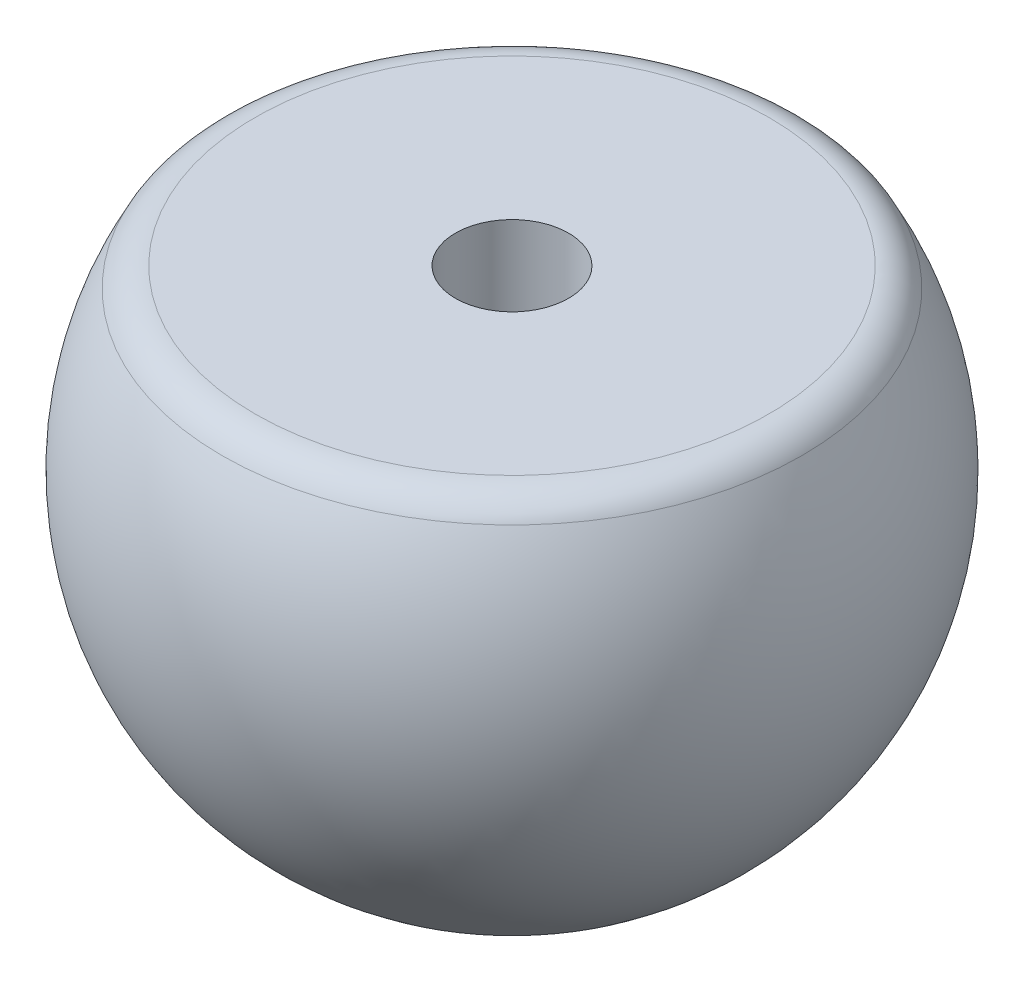
ISO-10303-21;
HEADER;
FILE_DESCRIPTION(('STEP AP214'),'2;1');
FILE_NAME('part.step','',(''),(''),'','','');
FILE_SCHEMA(('AUTOMOTIVE_DESIGN { 1 0 10303 214 1 1 1 1 }'));
ENDSEC;
DATA;
#1=APPLICATION_CONTEXT('core data for automotive mechanical design processes');
#2=APPLICATION_PROTOCOL_DEFINITION('international standard','automotive_design',2000,#1);
#3=PRODUCT_CONTEXT('',#1,'mechanical');
#4=PRODUCT('Part','Part','',(#3));
#5=PRODUCT_RELATED_PRODUCT_CATEGORY('part','',(#4));
#6=PRODUCT_DEFINITION_FORMATION('','',#4);
#7=PRODUCT_DEFINITION_CONTEXT('part definition',#1,'design');
#8=PRODUCT_DEFINITION('design','',#6,#7);
#9=PRODUCT_DEFINITION_SHAPE('','',#8);
#10=(LENGTH_UNIT() NAMED_UNIT(*) SI_UNIT(.MILLI.,.METRE.));
#11=(NAMED_UNIT(*) PLANE_ANGLE_UNIT() SI_UNIT($,.RADIAN.));
#12=(NAMED_UNIT(*) SI_UNIT($,.STERADIAN.) SOLID_ANGLE_UNIT());
#13=UNCERTAINTY_MEASURE_WITH_UNIT(LENGTH_MEASURE(1.E-05),#10,'distance_accuracy_value','');
#14=(GEOMETRIC_REPRESENTATION_CONTEXT(3) GLOBAL_UNCERTAINTY_ASSIGNED_CONTEXT((#13)) GLOBAL_UNIT_ASSIGNED_CONTEXT((#10,
#11,#12)) REPRESENTATION_CONTEXT('',''));
#15=CARTESIAN_POINT('',(0.,0.,0.));
#16=DIRECTION('',(0.,0.,1.));
#17=DIRECTION('',(1.,0.,0.));
#18=AXIS2_PLACEMENT_3D('',#15,#16,#17);
#19=CARTESIAN_POINT('',(-1.22225853137219,-6.0733775493191,0.));
#20=DIRECTION('',(0.,1.,0.));
#21=DIRECTION('',(0.,0.,1.));
#22=AXIS2_PLACEMENT_3D('',#19,#20,#21);
#23=CYLINDRICAL_SURFACE('',#22,1.51);
#24=CARTESIAN_POINT('',(-1.22225853137219,7.44160475152618,0.));
#25=DIRECTION('',(0.,1.,0.));
#26=DIRECTION('',(0.,0.,1.));
#27=AXIS2_PLACEMENT_3D('',#24,#25,#26);
#28=CIRCLE('',#27,1.51);
#29=CARTESIAN_POINT('',(-1.22225853137219,7.44160475152618,1.51));
#30=VERTEX_POINT('',#29);
#31=EDGE_CURVE('E44',#30,#30,#28,.T.);
#32=ORIENTED_EDGE('',*,*,#31,.T.);
#33=EDGE_LOOP('',(#32));
#34=FACE_BOUND('',#33,.T.);
#35=CARTESIAN_POINT('',(-1.22225853137219,-2.,0.));
#36=DIRECTION('',(0.,-1.,0.));
#37=DIRECTION('',(0.,0.,-1.));
#38=AXIS2_PLACEMENT_3D('',#35,#36,#37);
#39=CIRCLE('',#38,1.51);
#40=CARTESIAN_POINT('',(-1.22225853137219,-2.,-1.51));
#41=VERTEX_POINT('',#40);
#42=EDGE_CURVE('E51',#41,#41,#39,.F.);
#43=ORIENTED_EDGE('',*,*,#42,.F.);
#44=EDGE_LOOP('',(#43));
#45=FACE_BOUND('',#44,.T.);
#46=ADVANCED_FACE('F33',(#34,#45),#23,.F.);
#47=CARTESIAN_POINT('',(-1.22225853137217,2.7266224506809,0.));
#48=DIRECTION('',(0.,1.,0.));
#49=DIRECTION('',(-1.,0.,0.));
#50=AXIS2_PLACEMENT_3D('',#47,#48,#49);
#51=SPHERICAL_SURFACE('',#50,8.80000000000001);
#52=CARTESIAN_POINT('',(-1.22225853137217,6.91788453368583,0.));
#53=DIRECTION('',(0.,-1.,0.));
#54=DIRECTION('',(0.,0.,-1.));
#55=AXIS2_PLACEMENT_3D('',#52,#53,#54);
#56=CIRCLE('',#55,7.73778535186686);
#57=CARTESIAN_POINT('',(-8.96004388323903,6.91788453368583,0.));
#58=VERTEX_POINT('',#57);
#59=EDGE_CURVE('E10',#58,#58,#56,.T.);
#60=CARTESIAN_POINT('',(-1.22225853137217,-5.,0.));
#61=DIRECTION('',(0.,1.,0.));
#62=DIRECTION('',(0.,0.,1.));
#63=AXIS2_PLACEMENT_3D('',#60,#61,#62);
#64=CIRCLE('',#63,4.21180549226029);
#65=CARTESIAN_POINT('',(-5.43406402363246,-5.,0.));
#66=VERTEX_POINT('',#65);
#67=EDGE_CURVE('E48',#66,#66,#64,.F.);
#68=CARTESIAN_POINT('',(-8.96004388323903,6.91788453368583,0.));
#69=CARTESIAN_POINT('',(-9.02850998908292,6.79149078327528,0.));
#70=CARTESIAN_POINT('',(-9.09387377737207,6.66341691930284,0.));
#71=CARTESIAN_POINT('',(-9.21825180716726,6.40422223236278,0.));
#72=CARTESIAN_POINT('',(-9.27726604867331,6.27310140939516,0.));
#73=CARTESIAN_POINT('',(-9.38880007322867,6.0081260725934,0.));
#74=CARTESIAN_POINT('',(-9.44131985627799,5.87427155875926,0.));
#75=CARTESIAN_POINT('',(-9.53973972995896,5.60415063200418,0.));
#76=CARTESIAN_POINT('',(-9.5856398205906,5.46788421908325,0.));
#77=CARTESIAN_POINT('',(-9.67070987446705,5.19326655153981,0.));
#78=CARTESIAN_POINT('',(-9.70987983771186,5.0549152969173,0.));
#79=CARTESIAN_POINT('',(-9.781395653802,4.77646014968593,0.));
#80=CARTESIAN_POINT('',(-9.81374150664735,4.63635625707706,0.));
#81=CARTESIAN_POINT('',(-9.87153142466644,4.35473220786819,0.));
#82=CARTESIAN_POINT('',(-9.89697548984019,4.21321205126818,0.));
#83=CARTESIAN_POINT('',(-9.94090074712414,3.92909525855089,0.));
#84=CARTESIAN_POINT('',(-9.95938193923435,3.78649862243359,0.));
#85=CARTESIAN_POINT('',(-9.98933707684359,3.50057123701793,0.));
#86=CARTESIAN_POINT('',(-10.0008110223426,3.35724048771957,0.));
#87=CARTESIAN_POINT('',(-10.0167241187186,3.07018900556999,0.));
#88=CARTESIAN_POINT('',(-10.0211632695955,2.92646827271877,0.));
#89=CARTESIAN_POINT('',(-10.0229961184774,2.63898188922701,0.));
#90=CARTESIAN_POINT('',(-10.0203898164825,2.49521623858647,0.));
#91=CARTESIAN_POINT('',(-10.0081380172354,2.20798519317687,0.));
#92=CARTESIAN_POINT('',(-9.99849251998338,2.06451979840781,0.));
#93=CARTESIAN_POINT('',(-9.97218548853988,1.77823371748975,0.));
#94=CARTESIAN_POINT('',(-9.95552395434844,1.63541303134073,0.));
#95=CARTESIAN_POINT('',(-9.91522485248164,1.35075927250407,0.));
#96=CARTESIAN_POINT('',(-9.89158728480628,1.20892619981642,0.));
#97=CARTESIAN_POINT('',(-9.8373928685089,0.926588201535627,0.));
#98=CARTESIAN_POINT('',(-9.80683601988688,0.786083275942482,0.));
#99=CARTESIAN_POINT('',(-9.73887640705804,0.506738916673852,0.));
#100=CARTESIAN_POINT('',(-9.70147364285123,0.367899482998368,0.));
#101=CARTESIAN_POINT('',(-9.61991200089224,0.0922194536310042,0.));
#102=CARTESIAN_POINT('',(-9.57575312314006,-0.0446211420608753,0.));
#103=CARTESIAN_POINT('',(-9.4807852771977,-0.315974948498363,0.));
#104=CARTESIAN_POINT('',(-9.42997630900751,-0.450488159243971,0.));
#105=CARTESIAN_POINT('',(-9.32183027180835,-0.716864236753081,0.));
#106=CARTESIAN_POINT('',(-9.26449320279939,-0.848727103516582,0.));
#107=CARTESIAN_POINT('',(-9.14342862720374,-1.10948589736054,0.));
#108=CARTESIAN_POINT('',(-9.07970112061705,-1.238381824441,0.));
#109=CARTESIAN_POINT('',(-8.94600867620511,-1.49289726667968,0.));
#110=CARTESIAN_POINT('',(-8.87604373837986,-1.61851678183792,0.));
#111=CARTESIAN_POINT('',(-8.73004441357382,-1.86617779449042,0.));
#112=CARTESIAN_POINT('',(-8.65401002659303,-1.98821929198469,0.));
#113=CARTESIAN_POINT('',(-8.4960543579654,-2.22843125416932,0.));
#114=CARTESIAN_POINT('',(-8.41413307631855,-2.34660171885969,0.));
#115=CARTESIAN_POINT('',(-8.24460030703076,-2.57878789454238,0.));
#116=CARTESIAN_POINT('',(-8.15698881938981,-2.6928036055347,0.));
#117=CARTESIAN_POINT('',(-7.97628598843236,-2.91640652788543,0.));
#118=CARTESIAN_POINT('',(-7.88319464511586,-3.02599373924384,0.));
#119=CARTESIAN_POINT('',(-7.69175561084043,-3.24047655041321,0.));
#120=CARTESIAN_POINT('',(-7.59340791988151,-3.34537215022418,0.));
#121=CARTESIAN_POINT('',(-7.39169231530356,-3.55021988535252,0.));
#122=CARTESIAN_POINT('',(-7.28832440168455,-3.65017202066989,0.));
#123=CARTESIAN_POINT('',(-7.07681654222464,-3.84489286279362,0.));
#124=CARTESIAN_POINT('',(-6.96867659638375,-3.93966156959998,0.));
#125=CARTESIAN_POINT('',(-6.74788427489618,-4.12378796142274,0.));
#126=CARTESIAN_POINT('',(-6.63523189924949,-4.21314564643914,0.));
#127=CARTESIAN_POINT('',(-6.4056853241667,-4.38623567062933,0.));
#128=CARTESIAN_POINT('',(-6.28879112473059,-4.46996800980312,0.));
#129=CARTESIAN_POINT('',(-6.05104105990518,-4.63160548819916,0.));
#130=CARTESIAN_POINT('',(-5.93018519451587,-4.70951062742142,0.));
#131=CARTESIAN_POINT('',(-5.68480382816155,-4.85930970979438,0.));
#132=CARTESIAN_POINT('',(-5.56027832719655,-4.93120365294508,0.));
#133=CARTESIAN_POINT('',(-5.43406402363246,-5.,0.));
#134=B_SPLINE_CURVE_WITH_KNOTS('',3,(#68,#69,#70,#71,#72,#73,#74,#75,#76,#77,#78,#79,#80,#81,
#82,#83,#84,#85,#86,#87,#88,#89,#90,#91,#92,#93,#94,#95,#96,#97,#98,#99,#100,#101,#102,#103,
#104,#105,#106,#107,#108,#109,#110,#111,#112,#113,#114,#115,#116,#117,#118,#119,#120,#121,#122,
#123,#124,#125,#126,#127,#128,#129,#130,#131,#132,#133),.UNSPECIFIED.,.F.,.F.,(4,2,2,2,2,2,2,2,
2,2,2,2,2,2,2,2,2,2,2,2,2,2,2,2,2,2,2,2,2,2,2,2,4),(0.,0.431195204690635,0.862390409381273,
1.29358561407191,1.72478081876255,2.15597602345318,2.58717122814382,3.01836643283446,
3.4495616375251,3.88075684221573,4.31195204690637,4.74314725159701,5.17434245628764,
5.60553766097828,6.03673286566892,6.46792807035956,6.89912327505019,7.33031847974083,
7.76151368443147,8.1927088891221,8.62390409381274,9.05509929850338,9.48629450319402,
9.91748970788465,10.3486849125753,10.7798801172659,11.2110753219566,11.6422705266472,
12.0734657313378,12.5046609360285,12.9358561407191,13.3670513454097,13.7982465501004),.UNSPECIFIED.);
#135=EDGE_CURVE('BSEAM79',#58,#66,#134,.T.);
#136=ORIENTED_EDGE('',*,*,#59,.T.);
#137=ORIENTED_EDGE('',*,*,#67,.F.);
#138=ORIENTED_EDGE('',*,*,#135,.T.);
#139=ORIENTED_EDGE('',*,*,#135,.F.);
#140=EDGE_LOOP('',(#136,#138,#137,#139));
#141=FACE_BOUND('',#140,.T.);
#142=ADVANCED_FACE('F79',(#141),#51,.T.);
#143=CARTESIAN_POINT('',(-1.22225853137219,7.44160475152618,0.));
#144=DIRECTION('',(0.,1.,0.));
#145=DIRECTION('',(0.,0.,1.));
#146=AXIS2_PLACEMENT_3D('',#143,#144,#145);
#147=PLANE('',#146);
#148=CARTESIAN_POINT('',(-1.22225853137217,7.44160475152618,0.));
#149=DIRECTION('',(0.,1.,0.));
#150=DIRECTION('',(0.,0.,1.));
#151=AXIS2_PLACEMENT_3D('',#148,#149,#150);
#152=CIRCLE('',#151,6.85849156188199);
#153=CARTESIAN_POINT('',(-1.22225853137217,7.44160475152618,6.85849156188199));
#154=VERTEX_POINT('',#153);
#155=EDGE_CURVE('E40',#154,#154,#152,.T.);
#156=ORIENTED_EDGE('',*,*,#155,.T.);
#157=EDGE_LOOP('',(#156));
#158=FACE_BOUND('',#157,.T.);
#159=ORIENTED_EDGE('',*,*,#31,.F.);
#160=EDGE_LOOP('',(#159));
#161=FACE_BOUND('',#160,.T.);
#162=ADVANCED_FACE('F75',(#158,#161),#147,.T.);
#163=CARTESIAN_POINT('',(-1.22225853137219,-5.,0.));
#164=DIRECTION('',(0.,1.,0.));
#165=DIRECTION('',(0.,0.,1.));
#166=AXIS2_PLACEMENT_3D('',#163,#164,#165);
#167=PLANE('',#166);
#168=CARTESIAN_POINT('',(-1.22225853137219,-5.,0.));
#169=DIRECTION('',(0.,-1.,0.));
#170=DIRECTION('',(0.,0.,-1.));
#171=AXIS2_PLACEMENT_3D('',#168,#169,#170);
#172=CIRCLE('',#171,3.67690330127111);
#173=CARTESIAN_POINT('',(-1.22225853137219,-5.,-3.67690330127111));
#174=VERTEX_POINT('',#173);
#175=EDGE_CURVE('E57',#174,#174,#172,.T.);
#176=ORIENTED_EDGE('',*,*,#175,.F.);
#177=EDGE_LOOP('',(#176));
#178=FACE_BOUND('',#177,.T.);
#179=ORIENTED_EDGE('',*,*,#67,.T.);
#180=EDGE_LOOP('',(#179));
#181=FACE_BOUND('',#180,.T.);
#182=ADVANCED_FACE('F72',(#178,#181),#167,.F.);
#183=CARTESIAN_POINT('',(-1.22225853137219,-2.,0.));
#184=DIRECTION('',(0.,-1.,0.));
#185=DIRECTION('',(0.,0.,-1.));
#186=AXIS2_PLACEMENT_3D('',#183,#184,#185);
#187=PLANE('',#186);
#188=CARTESIAN_POINT('',(-1.22225853137219,-2.,0.));
#189=DIRECTION('',(0.,-1.,0.));
#190=DIRECTION('',(0.,0.,-1.));
#191=AXIS2_PLACEMENT_3D('',#188,#189,#190);
#192=CIRCLE('',#191,3.67690330127111);
#193=CARTESIAN_POINT('',(-1.22225853137219,-2.,-3.67690330127111));
#194=VERTEX_POINT('',#193);
#195=EDGE_CURVE('E53',#194,#194,#192,.T.);
#196=ORIENTED_EDGE('',*,*,#195,.T.);
#197=EDGE_LOOP('',(#196));
#198=FACE_BOUND('',#197,.T.);
#199=ORIENTED_EDGE('',*,*,#42,.T.);
#200=EDGE_LOOP('',(#199));
#201=FACE_BOUND('',#200,.T.);
#202=ADVANCED_FACE('F63',(#198,#201),#187,.T.);
#203=CARTESIAN_POINT('',(-1.22225853137219,-2.,0.));
#204=DIRECTION('',(0.,-1.,0.));
#205=DIRECTION('',(0.,0.,-1.));
#206=AXIS2_PLACEMENT_3D('',#203,#204,#205);
#207=CYLINDRICAL_SURFACE('',#206,3.67690330127111);
#208=ORIENTED_EDGE('',*,*,#195,.F.);
#209=EDGE_LOOP('',(#208));
#210=FACE_BOUND('',#209,.T.);
#211=ORIENTED_EDGE('',*,*,#175,.T.);
#212=EDGE_LOOP('',(#211));
#213=FACE_BOUND('',#212,.T.);
#214=ADVANCED_FACE('F66',(#210,#213),#207,.F.);
#215=CARTESIAN_POINT('',(-1.22225853137217,6.44160475152618,0.));
#216=DIRECTION('',(0.,1.,0.));
#217=DIRECTION('',(0.,0.,1.));
#218=AXIS2_PLACEMENT_3D('',#215,#216,#217);
#219=TOROIDAL_SURFACE('',#218,6.85849156188199,1.);
#220=ORIENTED_EDGE('',*,*,#59,.F.);
#221=EDGE_LOOP('',(#220));
#222=FACE_BOUND('',#221,.T.);
#223=ORIENTED_EDGE('',*,*,#155,.F.);
#224=EDGE_LOOP('',(#223));
#225=FACE_BOUND('',#224,.T.);
#226=ADVANCED_FACE('F35',(#222,#225),#219,.T.);
#227=CLOSED_SHELL('',(#46,#142,#162,#182,#202,#214,#226));
#228=MANIFOLD_SOLID_BREP('B2',#227);
#229=ADVANCED_BREP_SHAPE_REPRESENTATION('',(#18,#228),#14);
#230=SHAPE_DEFINITION_REPRESENTATION(#9,#229);
ENDSEC;
END-ISO-10303-21;
